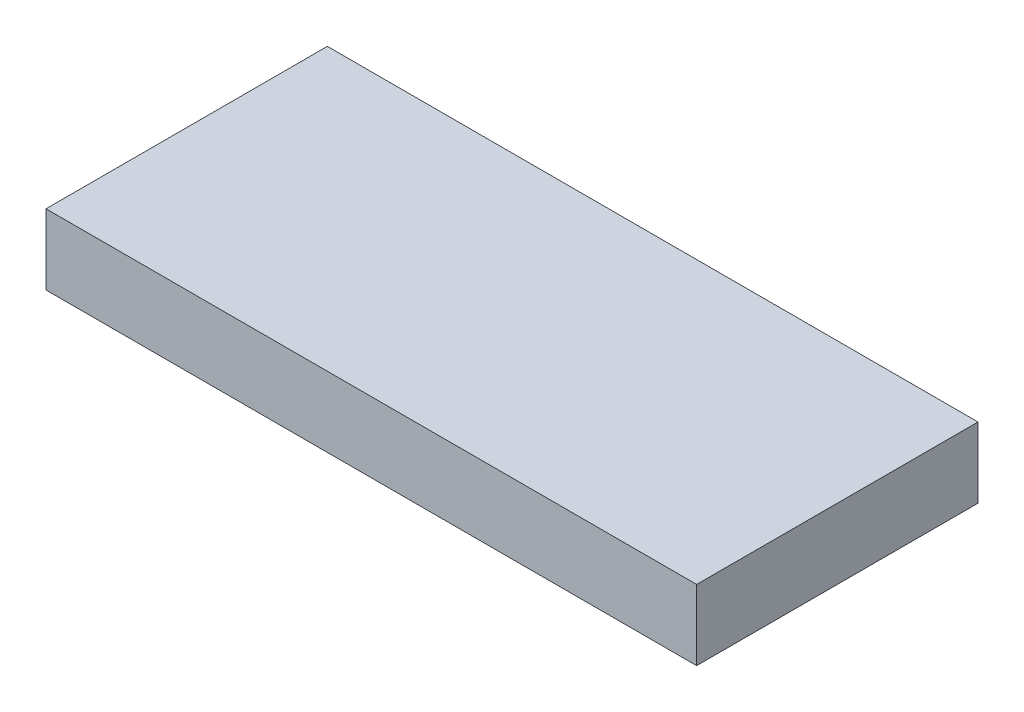
ISO-10303-21;
HEADER;
FILE_DESCRIPTION(('STEP AP214'),'2;1');
FILE_NAME('part.step','',(''),(''),'','','');
FILE_SCHEMA(('AUTOMOTIVE_DESIGN { 1 0 10303 214 1 1 1 1 }'));
ENDSEC;
DATA;
#1=APPLICATION_CONTEXT('core data for automotive mechanical design processes');
#2=APPLICATION_PROTOCOL_DEFINITION('international standard','automotive_design',2000,#1);
#3=PRODUCT_CONTEXT('',#1,'mechanical');
#4=PRODUCT('Part','Part','',(#3));
#5=PRODUCT_RELATED_PRODUCT_CATEGORY('part','',(#4));
#6=PRODUCT_DEFINITION_FORMATION('','',#4);
#7=PRODUCT_DEFINITION_CONTEXT('part definition',#1,'design');
#8=PRODUCT_DEFINITION('design','',#6,#7);
#9=PRODUCT_DEFINITION_SHAPE('','',#8);
#10=(LENGTH_UNIT() NAMED_UNIT(*) SI_UNIT(.MILLI.,.METRE.));
#11=(NAMED_UNIT(*) PLANE_ANGLE_UNIT() SI_UNIT($,.RADIAN.));
#12=(NAMED_UNIT(*) SI_UNIT($,.STERADIAN.) SOLID_ANGLE_UNIT());
#13=UNCERTAINTY_MEASURE_WITH_UNIT(LENGTH_MEASURE(1.E-05),#10,'distance_accuracy_value','');
#14=(GEOMETRIC_REPRESENTATION_CONTEXT(3) GLOBAL_UNCERTAINTY_ASSIGNED_CONTEXT((#13)) GLOBAL_UNIT_ASSIGNED_CONTEXT((#10,
#11,#12)) REPRESENTATION_CONTEXT('',''));
#15=CARTESIAN_POINT('',(0.,0.,0.));
#16=DIRECTION('',(0.,0.,1.));
#17=DIRECTION('',(1.,0.,0.));
#18=AXIS2_PLACEMENT_3D('',#15,#16,#17);
#19=CARTESIAN_POINT('',(0.,6.34999999999999,0.));
#20=DIRECTION('',(1.,0.,0.));
#21=DIRECTION('',(0.,0.,-1.));
#22=AXIS2_PLACEMENT_3D('',#19,#20,#21);
#23=PLANE('',#22);
#24=DIRECTION('',(0.,0.,1.));
#25=VECTOR('',#24,1.);
#26=CARTESIAN_POINT('',(0.,0.,0.));
#27=LINE('',#26,#25);
#28=CARTESIAN_POINT('',(0.,0.,-304.8));
#29=VERTEX_POINT('',#28);
#30=CARTESIAN_POINT('',(0.,0.,-279.4));
#31=VERTEX_POINT('',#30);
#32=EDGE_CURVE('E99',#29,#31,#27,.T.);
#33=ORIENTED_EDGE('',*,*,#32,.T.);
#34=DIRECTION('',(0.,1.,0.));
#35=VECTOR('',#34,1.);
#36=CARTESIAN_POINT('',(0.,0.,-279.4));
#37=LINE('',#36,#35);
#38=CARTESIAN_POINT('',(0.,6.34999999999999,-279.4));
#39=VERTEX_POINT('',#38);
#40=EDGE_CURVE('E48',#31,#39,#37,.T.);
#41=ORIENTED_EDGE('',*,*,#40,.T.);
#42=DIRECTION('',(0.,0.,1.));
#43=VECTOR('',#42,1.);
#44=CARTESIAN_POINT('',(0.,6.34999999999999,0.));
#45=LINE('',#44,#43);
#46=CARTESIAN_POINT('',(0.,6.34999999999999,-304.8));
#47=VERTEX_POINT('',#46);
#48=EDGE_CURVE('E101',#47,#39,#45,.T.);
#49=ORIENTED_EDGE('',*,*,#48,.F.);
#50=DIRECTION('',(0.,-1.,0.));
#51=VECTOR('',#50,1.);
#52=CARTESIAN_POINT('',(0.,6.34999999999999,-304.8));
#53=LINE('',#52,#51);
#54=EDGE_CURVE('E11',#47,#29,#53,.T.);
#55=ORIENTED_EDGE('',*,*,#54,.T.);
#56=EDGE_LOOP('',(#33,#41,#49,#55));
#57=FACE_BOUND('',#56,.T.);
#58=ADVANCED_FACE('F34',(#57),#23,.F.);
#59=CARTESIAN_POINT('',(0.,6.34999999999999,-304.8));
#60=DIRECTION('',(0.,0.,1.));
#61=DIRECTION('',(1.,0.,0.));
#62=AXIS2_PLACEMENT_3D('',#59,#60,#61);
#63=PLANE('',#62);
#64=DIRECTION('',(-1.,0.,0.));
#65=VECTOR('',#64,1.);
#66=CARTESIAN_POINT('',(0.,6.34999999999999,-304.8));
#67=LINE('',#66,#65);
#68=CARTESIAN_POINT('',(58.7375,6.34999999999999,-304.8));
#69=VERTEX_POINT('',#68);
#70=EDGE_CURVE('E41',#69,#47,#67,.T.);
#71=ORIENTED_EDGE('',*,*,#70,.F.);
#72=DIRECTION('',(0.,1.,0.));
#73=VECTOR('',#72,1.);
#74=CARTESIAN_POINT('',(58.7375,0.,-304.8));
#75=LINE('',#74,#73);
#76=CARTESIAN_POINT('',(58.7375,0.,-304.8));
#77=VERTEX_POINT('',#76);
#78=EDGE_CURVE('E97',#77,#69,#75,.T.);
#79=ORIENTED_EDGE('',*,*,#78,.F.);
#80=DIRECTION('',(-1.,0.,0.));
#81=VECTOR('',#80,1.);
#82=CARTESIAN_POINT('',(0.,0.,-304.8));
#83=LINE('',#82,#81);
#84=EDGE_CURVE('E91',#77,#29,#83,.T.);
#85=ORIENTED_EDGE('',*,*,#84,.T.);
#86=ORIENTED_EDGE('',*,*,#54,.F.);
#87=EDGE_LOOP('',(#71,#79,#85,#86));
#88=FACE_BOUND('',#87,.T.);
#89=ADVANCED_FACE('F105',(#88),#63,.F.);
#90=CARTESIAN_POINT('',(0.,6.34999999999999,0.));
#91=DIRECTION('',(0.,-1.,0.));
#92=DIRECTION('',(0.,0.,-1.));
#93=AXIS2_PLACEMENT_3D('',#90,#91,#92);
#94=PLANE('',#93);
#95=DIRECTION('',(-1.,0.,0.));
#96=VECTOR('',#95,1.);
#97=CARTESIAN_POINT('',(58.7375,6.34999999999999,-279.4));
#98=LINE('',#97,#96);
#99=CARTESIAN_POINT('',(58.7375,6.34999999999999,-279.4));
#100=VERTEX_POINT('',#99);
#101=EDGE_CURVE('E92',#100,#39,#98,.T.);
#102=ORIENTED_EDGE('',*,*,#101,.F.);
#103=DIRECTION('',(0.,0.,1.));
#104=VECTOR('',#103,1.);
#105=CARTESIAN_POINT('',(58.7375,6.34999999999999,-304.8));
#106=LINE('',#105,#104);
#107=EDGE_CURVE('E80',#69,#100,#106,.T.);
#108=ORIENTED_EDGE('',*,*,#107,.F.);
#109=ORIENTED_EDGE('',*,*,#70,.T.);
#110=ORIENTED_EDGE('',*,*,#48,.T.);
#111=EDGE_LOOP('',(#102,#108,#109,#110));
#112=FACE_BOUND('',#111,.T.);
#113=ADVANCED_FACE('F108',(#112),#94,.F.);
#114=CARTESIAN_POINT('',(0.,0.,0.));
#115=DIRECTION('',(0.,-1.,0.));
#116=DIRECTION('',(0.,0.,-1.));
#117=AXIS2_PLACEMENT_3D('',#114,#115,#116);
#118=PLANE('',#117);
#119=DIRECTION('',(0.,0.,1.));
#120=VECTOR('',#119,1.);
#121=CARTESIAN_POINT('',(58.7375,0.,-304.8));
#122=LINE('',#121,#120);
#123=CARTESIAN_POINT('',(58.7375,0.,-279.4));
#124=VERTEX_POINT('',#123);
#125=EDGE_CURVE('E78',#77,#124,#122,.T.);
#126=ORIENTED_EDGE('',*,*,#125,.T.);
#127=DIRECTION('',(-1.,0.,0.));
#128=VECTOR('',#127,1.);
#129=CARTESIAN_POINT('',(58.7375,0.,-279.4));
#130=LINE('',#129,#128);
#131=EDGE_CURVE('E82',#124,#31,#130,.T.);
#132=ORIENTED_EDGE('',*,*,#131,.T.);
#133=ORIENTED_EDGE('',*,*,#32,.F.);
#134=ORIENTED_EDGE('',*,*,#84,.F.);
#135=EDGE_LOOP('',(#126,#132,#133,#134));
#136=FACE_BOUND('',#135,.T.);
#137=ADVANCED_FACE('F90',(#136),#118,.T.);
#138=CARTESIAN_POINT('',(58.7375,0.,-304.8));
#139=DIRECTION('',(-1.,0.,0.));
#140=DIRECTION('',(0.,0.,1.));
#141=AXIS2_PLACEMENT_3D('',#138,#139,#140);
#142=PLANE('',#141);
#143=ORIENTED_EDGE('',*,*,#107,.T.);
#144=DIRECTION('',(0.,1.,0.));
#145=VECTOR('',#144,1.);
#146=CARTESIAN_POINT('',(58.7375,0.,-279.4));
#147=LINE('',#146,#145);
#148=EDGE_CURVE('E75',#124,#100,#147,.T.);
#149=ORIENTED_EDGE('',*,*,#148,.F.);
#150=ORIENTED_EDGE('',*,*,#125,.F.);
#151=ORIENTED_EDGE('',*,*,#78,.T.);
#152=EDGE_LOOP('',(#143,#149,#150,#151));
#153=FACE_BOUND('',#152,.T.);
#154=ADVANCED_FACE('F76',(#153),#142,.F.);
#155=CARTESIAN_POINT('',(58.7375,0.,-279.4));
#156=DIRECTION('',(0.,0.,-1.));
#157=DIRECTION('',(-1.,0.,0.));
#158=AXIS2_PLACEMENT_3D('',#155,#156,#157);
#159=PLANE('',#158);
#160=ORIENTED_EDGE('',*,*,#101,.T.);
#161=ORIENTED_EDGE('',*,*,#40,.F.);
#162=ORIENTED_EDGE('',*,*,#131,.F.);
#163=ORIENTED_EDGE('',*,*,#148,.T.);
#164=EDGE_LOOP('',(#160,#161,#162,#163));
#165=FACE_BOUND('',#164,.T.);
#166=ADVANCED_FACE('F84',(#165),#159,.F.);
#167=CLOSED_SHELL('',(#58,#89,#113,#137,#154,#166));
#168=MANIFOLD_SOLID_BREP('B2',#167);
#169=ADVANCED_BREP_SHAPE_REPRESENTATION('',(#18,#168),#14);
#170=SHAPE_DEFINITION_REPRESENTATION(#9,#169);
ENDSEC;
END-ISO-10303-21;
